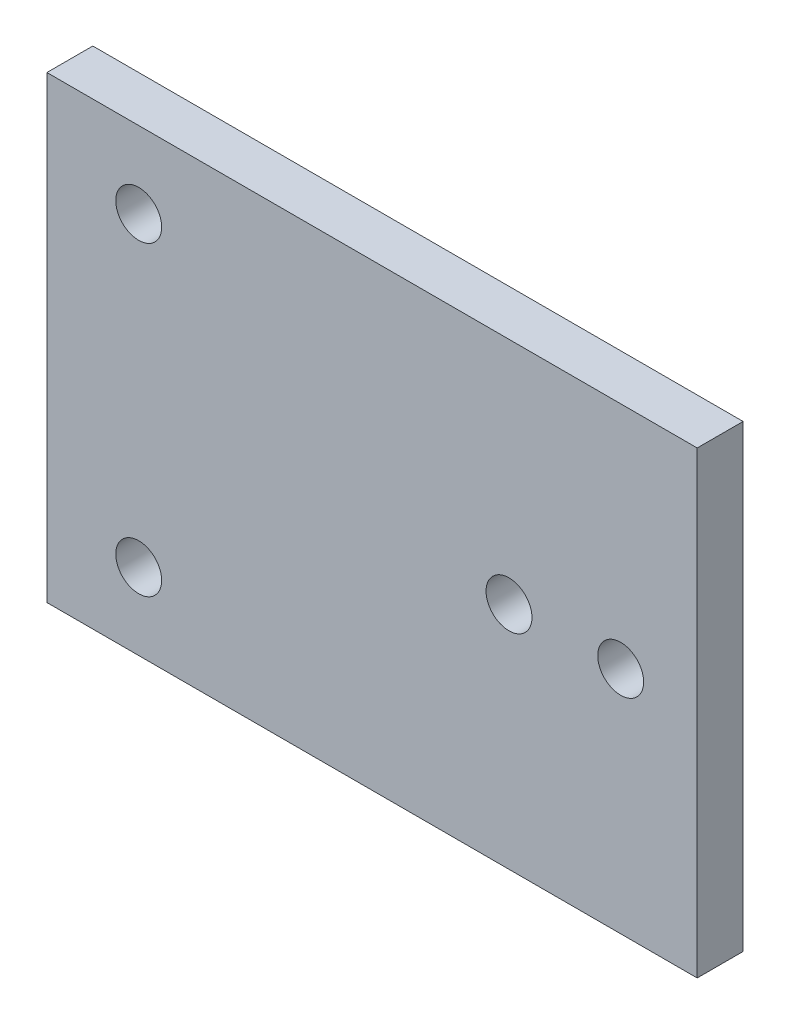
ISO-10303-21;
HEADER;
FILE_DESCRIPTION(('STEP AP214'),'2;1');
FILE_NAME('part.step','',(''),(''),'','','');
FILE_SCHEMA(('AUTOMOTIVE_DESIGN { 1 0 10303 214 1 1 1 1 }'));
ENDSEC;
DATA;
#1=APPLICATION_CONTEXT('core data for automotive mechanical design processes');
#2=APPLICATION_PROTOCOL_DEFINITION('international standard','automotive_design',2000,#1);
#3=PRODUCT_CONTEXT('',#1,'mechanical');
#4=PRODUCT('Part','Part','',(#3));
#5=PRODUCT_RELATED_PRODUCT_CATEGORY('part','',(#4));
#6=PRODUCT_DEFINITION_FORMATION('','',#4);
#7=PRODUCT_DEFINITION_CONTEXT('part definition',#1,'design');
#8=PRODUCT_DEFINITION('design','',#6,#7);
#9=PRODUCT_DEFINITION_SHAPE('','',#8);
#10=(LENGTH_UNIT() NAMED_UNIT(*) SI_UNIT(.MILLI.,.METRE.));
#11=(NAMED_UNIT(*) PLANE_ANGLE_UNIT() SI_UNIT($,.RADIAN.));
#12=(NAMED_UNIT(*) SI_UNIT($,.STERADIAN.) SOLID_ANGLE_UNIT());
#13=UNCERTAINTY_MEASURE_WITH_UNIT(LENGTH_MEASURE(1.E-05),#10,'distance_accuracy_value','');
#14=(GEOMETRIC_REPRESENTATION_CONTEXT(3) GLOBAL_UNCERTAINTY_ASSIGNED_CONTEXT((#13)) GLOBAL_UNIT_ASSIGNED_CONTEXT((#10,
#11,#12)) REPRESENTATION_CONTEXT('',''));
#15=CARTESIAN_POINT('',(0.,0.,0.));
#16=DIRECTION('',(0.,0.,1.));
#17=DIRECTION('',(1.,0.,0.));
#18=AXIS2_PLACEMENT_3D('',#15,#16,#17);
#19=CARTESIAN_POINT('',(0.,0.,3.));
#20=DIRECTION('',(0.,0.,-1.));
#21=DIRECTION('',(-1.,0.,0.));
#22=AXIS2_PLACEMENT_3D('',#19,#20,#21);
#23=PLANE('',#22);
#24=DIRECTION('',(0.,-1.,0.));
#25=VECTOR('',#24,1.);
#26=CARTESIAN_POINT('',(0.,0.,3.));
#27=LINE('',#26,#25);
#28=CARTESIAN_POINT('',(0.,30.,3.));
#29=VERTEX_POINT('',#28);
#30=CARTESIAN_POINT('',(0.,0.,3.));
#31=VERTEX_POINT('',#30);
#32=EDGE_CURVE('E85',#29,#31,#27,.T.);
#33=ORIENTED_EDGE('',*,*,#32,.T.);
#34=DIRECTION('',(1.,0.,0.));
#35=VECTOR('',#34,1.);
#36=CARTESIAN_POINT('',(0.,0.,3.));
#37=LINE('',#36,#35);
#38=CARTESIAN_POINT('',(42.5,0.,3.));
#39=VERTEX_POINT('',#38);
#40=EDGE_CURVE('E80',#31,#39,#37,.T.);
#41=ORIENTED_EDGE('',*,*,#40,.T.);
#42=DIRECTION('',(0.,1.,0.));
#43=VECTOR('',#42,1.);
#44=CARTESIAN_POINT('',(42.5,0.,3.));
#45=LINE('',#44,#43);
#46=CARTESIAN_POINT('',(42.5,30.,3.));
#47=VERTEX_POINT('',#46);
#48=EDGE_CURVE('E83',#39,#47,#45,.T.);
#49=ORIENTED_EDGE('',*,*,#48,.T.);
#50=DIRECTION('',(-1.,0.,0.));
#51=VECTOR('',#50,1.);
#52=CARTESIAN_POINT('',(0.,30.,3.));
#53=LINE('',#52,#51);
#54=EDGE_CURVE('E50',#47,#29,#53,.T.);
#55=ORIENTED_EDGE('',*,*,#54,.T.);
#56=EDGE_LOOP('',(#33,#41,#49,#55));
#57=FACE_BOUND('',#56,.T.);
#58=CARTESIAN_POINT('',(6.,25.,3.));
#59=DIRECTION('',(0.,0.,1.));
#60=DIRECTION('',(1.,0.,0.));
#61=AXIS2_PLACEMENT_3D('',#58,#59,#60);
#62=CIRCLE('',#61,1.5);
#63=CARTESIAN_POINT('',(7.5,25.,3.));
#64=VERTEX_POINT('',#63);
#65=EDGE_CURVE('E100',#64,#64,#62,.T.);
#66=ORIENTED_EDGE('',*,*,#65,.F.);
#67=EDGE_LOOP('',(#66));
#68=FACE_BOUND('',#67,.T.);
#69=CARTESIAN_POINT('',(6.,5.,3.));
#70=DIRECTION('',(0.,0.,1.));
#71=DIRECTION('',(-1.,0.,0.));
#72=AXIS2_PLACEMENT_3D('',#69,#70,#71);
#73=CIRCLE('',#72,1.5);
#74=CARTESIAN_POINT('',(4.5,5.,3.));
#75=VERTEX_POINT('',#74);
#76=EDGE_CURVE('E115',#75,#75,#73,.T.);
#77=ORIENTED_EDGE('',*,*,#76,.F.);
#78=EDGE_LOOP('',(#77));
#79=FACE_BOUND('',#78,.T.);
#80=CARTESIAN_POINT('',(37.5,15.,3.));
#81=DIRECTION('',(0.,0.,1.));
#82=DIRECTION('',(1.,0.,0.));
#83=AXIS2_PLACEMENT_3D('',#80,#81,#82);
#84=CIRCLE('',#83,1.5);
#85=CARTESIAN_POINT('',(39.,15.,3.));
#86=VERTEX_POINT('',#85);
#87=EDGE_CURVE('E121',#86,#86,#84,.T.);
#88=ORIENTED_EDGE('',*,*,#87,.F.);
#89=EDGE_LOOP('',(#88));
#90=FACE_BOUND('',#89,.T.);
#91=CARTESIAN_POINT('',(30.2,15.,3.));
#92=DIRECTION('',(0.,0.,1.));
#93=DIRECTION('',(1.,0.,0.));
#94=AXIS2_PLACEMENT_3D('',#91,#92,#93);
#95=CIRCLE('',#94,1.5);
#96=CARTESIAN_POINT('',(31.7,15.,3.));
#97=VERTEX_POINT('',#96);
#98=EDGE_CURVE('E127',#97,#97,#95,.T.);
#99=ORIENTED_EDGE('',*,*,#98,.F.);
#100=EDGE_LOOP('',(#99));
#101=FACE_BOUND('',#100,.T.);
#102=ADVANCED_FACE('F33',(#57,#68,#79,#90,#101),#23,.F.);
#103=CARTESIAN_POINT('',(0.,0.,0.));
#104=DIRECTION('',(0.,0.,-1.));
#105=DIRECTION('',(-1.,0.,0.));
#106=AXIS2_PLACEMENT_3D('',#103,#104,#105);
#107=PLANE('',#106);
#108=CARTESIAN_POINT('',(37.5,15.,0.));
#109=DIRECTION('',(0.,0.,1.));
#110=DIRECTION('',(1.,0.,0.));
#111=AXIS2_PLACEMENT_3D('',#108,#109,#110);
#112=CIRCLE('',#111,1.5);
#113=CARTESIAN_POINT('',(39.,15.,0.));
#114=VERTEX_POINT('',#113);
#115=EDGE_CURVE('E124',#114,#114,#112,.T.);
#116=ORIENTED_EDGE('',*,*,#115,.T.);
#117=EDGE_LOOP('',(#116));
#118=FACE_BOUND('',#117,.T.);
#119=CARTESIAN_POINT('',(6.,25.,0.));
#120=DIRECTION('',(0.,0.,1.));
#121=DIRECTION('',(1.,0.,0.));
#122=AXIS2_PLACEMENT_3D('',#119,#120,#121);
#123=CIRCLE('',#122,1.5);
#124=CARTESIAN_POINT('',(7.5,25.,0.));
#125=VERTEX_POINT('',#124);
#126=EDGE_CURVE('E112',#125,#125,#123,.T.);
#127=ORIENTED_EDGE('',*,*,#126,.T.);
#128=EDGE_LOOP('',(#127));
#129=FACE_BOUND('',#128,.T.);
#130=DIRECTION('',(0.,-1.,0.));
#131=VECTOR('',#130,1.);
#132=CARTESIAN_POINT('',(0.,0.,0.));
#133=LINE('',#132,#131);
#134=CARTESIAN_POINT('',(0.,30.,0.));
#135=VERTEX_POINT('',#134);
#136=CARTESIAN_POINT('',(0.,0.,0.));
#137=VERTEX_POINT('',#136);
#138=EDGE_CURVE('E97',#135,#137,#133,.T.);
#139=ORIENTED_EDGE('',*,*,#138,.F.);
#140=DIRECTION('',(-1.,0.,0.));
#141=VECTOR('',#140,1.);
#142=CARTESIAN_POINT('',(0.,30.,0.));
#143=LINE('',#142,#141);
#144=CARTESIAN_POINT('',(42.5,30.,0.));
#145=VERTEX_POINT('',#144);
#146=EDGE_CURVE('E73',#145,#135,#143,.T.);
#147=ORIENTED_EDGE('',*,*,#146,.F.);
#148=DIRECTION('',(0.,1.,0.));
#149=VECTOR('',#148,1.);
#150=CARTESIAN_POINT('',(42.5,0.,0.));
#151=LINE('',#150,#149);
#152=CARTESIAN_POINT('',(42.5,0.,0.));
#153=VERTEX_POINT('',#152);
#154=EDGE_CURVE('E67',#153,#145,#151,.T.);
#155=ORIENTED_EDGE('',*,*,#154,.F.);
#156=DIRECTION('',(1.,0.,0.));
#157=VECTOR('',#156,1.);
#158=CARTESIAN_POINT('',(0.,0.,0.));
#159=LINE('',#158,#157);
#160=EDGE_CURVE('E89',#137,#153,#159,.T.);
#161=ORIENTED_EDGE('',*,*,#160,.F.);
#162=EDGE_LOOP('',(#139,#147,#155,#161));
#163=FACE_BOUND('',#162,.T.);
#164=CARTESIAN_POINT('',(6.,5.,0.));
#165=DIRECTION('',(0.,0.,1.));
#166=DIRECTION('',(-1.,0.,0.));
#167=AXIS2_PLACEMENT_3D('',#164,#165,#166);
#168=CIRCLE('',#167,1.5);
#169=CARTESIAN_POINT('',(4.5,5.,0.));
#170=VERTEX_POINT('',#169);
#171=EDGE_CURVE('E118',#170,#170,#168,.T.);
#172=ORIENTED_EDGE('',*,*,#171,.T.);
#173=EDGE_LOOP('',(#172));
#174=FACE_BOUND('',#173,.T.);
#175=CARTESIAN_POINT('',(30.2,15.,0.));
#176=DIRECTION('',(0.,0.,1.));
#177=DIRECTION('',(1.,0.,0.));
#178=AXIS2_PLACEMENT_3D('',#175,#176,#177);
#179=CIRCLE('',#178,1.5);
#180=CARTESIAN_POINT('',(31.7,15.,0.));
#181=VERTEX_POINT('',#180);
#182=EDGE_CURVE('E130',#181,#181,#179,.T.);
#183=ORIENTED_EDGE('',*,*,#182,.T.);
#184=EDGE_LOOP('',(#183));
#185=FACE_BOUND('',#184,.T.);
#186=ADVANCED_FACE('F108',(#118,#129,#163,#174,#185),#107,.T.);
#187=CARTESIAN_POINT('',(0.,0.,3.));
#188=DIRECTION('',(1.,0.,0.));
#189=DIRECTION('',(0.,0.,-1.));
#190=AXIS2_PLACEMENT_3D('',#187,#188,#189);
#191=PLANE('',#190);
#192=ORIENTED_EDGE('',*,*,#138,.T.);
#193=DIRECTION('',(0.,0.,-1.));
#194=VECTOR('',#193,1.);
#195=CARTESIAN_POINT('',(0.,0.,3.));
#196=LINE('',#195,#194);
#197=EDGE_CURVE('E11',#31,#137,#196,.T.);
#198=ORIENTED_EDGE('',*,*,#197,.F.);
#199=ORIENTED_EDGE('',*,*,#32,.F.);
#200=DIRECTION('',(0.,0.,-1.));
#201=VECTOR('',#200,1.);
#202=CARTESIAN_POINT('',(0.,30.,3.));
#203=LINE('',#202,#201);
#204=EDGE_CURVE('E93',#29,#135,#203,.T.);
#205=ORIENTED_EDGE('',*,*,#204,.T.);
#206=EDGE_LOOP('',(#192,#198,#199,#205));
#207=FACE_BOUND('',#206,.T.);
#208=ADVANCED_FACE('F35',(#207),#191,.F.);
#209=CARTESIAN_POINT('',(0.,0.,3.));
#210=DIRECTION('',(0.,1.,0.));
#211=DIRECTION('',(0.,0.,1.));
#212=AXIS2_PLACEMENT_3D('',#209,#210,#211);
#213=PLANE('',#212);
#214=ORIENTED_EDGE('',*,*,#160,.T.);
#215=DIRECTION('',(0.,0.,-1.));
#216=VECTOR('',#215,1.);
#217=CARTESIAN_POINT('',(42.5,0.,3.));
#218=LINE('',#217,#216);
#219=EDGE_CURVE('E42',#39,#153,#218,.T.);
#220=ORIENTED_EDGE('',*,*,#219,.F.);
#221=ORIENTED_EDGE('',*,*,#40,.F.);
#222=ORIENTED_EDGE('',*,*,#197,.T.);
#223=EDGE_LOOP('',(#214,#220,#221,#222));
#224=FACE_BOUND('',#223,.T.);
#225=ADVANCED_FACE('F88',(#224),#213,.F.);
#226=CARTESIAN_POINT('',(42.5,0.,3.));
#227=DIRECTION('',(-1.,0.,0.));
#228=DIRECTION('',(0.,0.,1.));
#229=AXIS2_PLACEMENT_3D('',#226,#227,#228);
#230=PLANE('',#229);
#231=ORIENTED_EDGE('',*,*,#154,.T.);
#232=DIRECTION('',(0.,0.,-1.));
#233=VECTOR('',#232,1.);
#234=CARTESIAN_POINT('',(42.5,30.,3.));
#235=LINE('',#234,#233);
#236=EDGE_CURVE('E90',#47,#145,#235,.T.);
#237=ORIENTED_EDGE('',*,*,#236,.F.);
#238=ORIENTED_EDGE('',*,*,#48,.F.);
#239=ORIENTED_EDGE('',*,*,#219,.T.);
#240=EDGE_LOOP('',(#231,#237,#238,#239));
#241=FACE_BOUND('',#240,.T.);
#242=ADVANCED_FACE('F91',(#241),#230,.F.);
#243=CARTESIAN_POINT('',(0.,30.,3.));
#244=DIRECTION('',(0.,-1.,0.));
#245=DIRECTION('',(0.,0.,-1.));
#246=AXIS2_PLACEMENT_3D('',#243,#244,#245);
#247=PLANE('',#246);
#248=ORIENTED_EDGE('',*,*,#146,.T.);
#249=ORIENTED_EDGE('',*,*,#204,.F.);
#250=ORIENTED_EDGE('',*,*,#54,.F.);
#251=ORIENTED_EDGE('',*,*,#236,.T.);
#252=EDGE_LOOP('',(#248,#249,#250,#251));
#253=FACE_BOUND('',#252,.T.);
#254=ADVANCED_FACE('F105',(#253),#247,.F.);
#255=CARTESIAN_POINT('',(6.,25.,3.));
#256=DIRECTION('',(0.,0.,-1.));
#257=DIRECTION('',(-1.,0.,0.));
#258=AXIS2_PLACEMENT_3D('',#255,#256,#257);
#259=CYLINDRICAL_SURFACE('',#258,1.5);
#260=ORIENTED_EDGE('',*,*,#65,.T.);
#261=EDGE_LOOP('',(#260));
#262=FACE_BOUND('',#261,.T.);
#263=ORIENTED_EDGE('',*,*,#126,.F.);
#264=EDGE_LOOP('',(#263));
#265=FACE_BOUND('',#264,.T.);
#266=ADVANCED_FACE('F147',(#262,#265),#259,.F.);
#267=CARTESIAN_POINT('',(6.,5.,3.));
#268=DIRECTION('',(0.,0.,-1.));
#269=DIRECTION('',(-1.,0.,0.));
#270=AXIS2_PLACEMENT_3D('',#267,#268,#269);
#271=CYLINDRICAL_SURFACE('',#270,1.5);
#272=ORIENTED_EDGE('',*,*,#76,.T.);
#273=EDGE_LOOP('',(#272));
#274=FACE_BOUND('',#273,.T.);
#275=ORIENTED_EDGE('',*,*,#171,.F.);
#276=EDGE_LOOP('',(#275));
#277=FACE_BOUND('',#276,.T.);
#278=ADVANCED_FACE('F193',(#274,#277),#271,.F.);
#279=CARTESIAN_POINT('',(37.5,15.,3.));
#280=DIRECTION('',(0.,0.,-1.));
#281=DIRECTION('',(-1.,0.,0.));
#282=AXIS2_PLACEMENT_3D('',#279,#280,#281);
#283=CYLINDRICAL_SURFACE('',#282,1.5);
#284=ORIENTED_EDGE('',*,*,#87,.T.);
#285=EDGE_LOOP('',(#284));
#286=FACE_BOUND('',#285,.T.);
#287=ORIENTED_EDGE('',*,*,#115,.F.);
#288=EDGE_LOOP('',(#287));
#289=FACE_BOUND('',#288,.T.);
#290=ADVANCED_FACE('F201',(#286,#289),#283,.F.);
#291=CARTESIAN_POINT('',(30.2,15.,3.));
#292=DIRECTION('',(0.,0.,-1.));
#293=DIRECTION('',(-1.,0.,0.));
#294=AXIS2_PLACEMENT_3D('',#291,#292,#293);
#295=CYLINDRICAL_SURFACE('',#294,1.5);
#296=ORIENTED_EDGE('',*,*,#98,.T.);
#297=EDGE_LOOP('',(#296));
#298=FACE_BOUND('',#297,.T.);
#299=ORIENTED_EDGE('',*,*,#182,.F.);
#300=EDGE_LOOP('',(#299));
#301=FACE_BOUND('',#300,.T.);
#302=ADVANCED_FACE('F136',(#298,#301),#295,.F.);
#303=CLOSED_SHELL('',(#102,#186,#208,#225,#242,#254,#266,#278,#290,#302));
#304=MANIFOLD_SOLID_BREP('B2',#303);
#305=ADVANCED_BREP_SHAPE_REPRESENTATION('',(#18,#304),#14);
#306=SHAPE_DEFINITION_REPRESENTATION(#9,#305);
ENDSEC;
END-ISO-10303-21;
